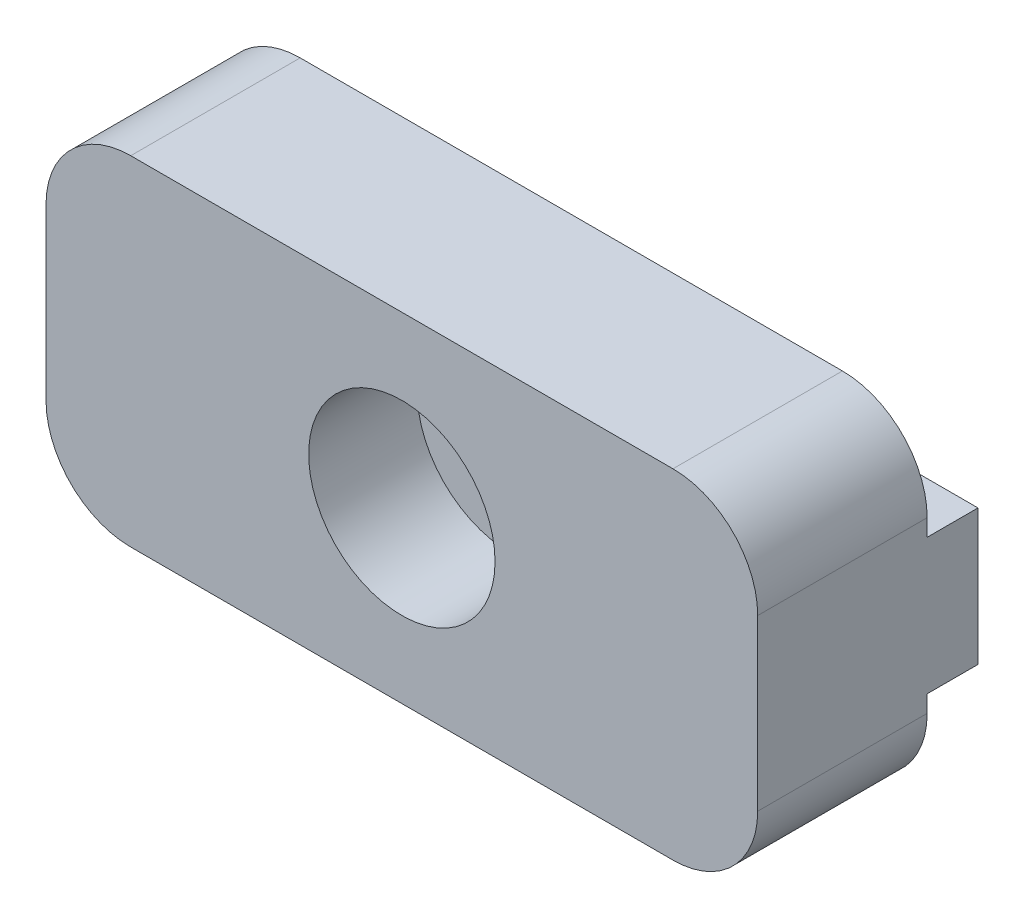
ISO-10303-21;
HEADER;
FILE_DESCRIPTION(('STEP AP214'),'2;1');
FILE_NAME('part.step','',(''),(''),'','','');
FILE_SCHEMA(('AUTOMOTIVE_DESIGN { 1 0 10303 214 1 1 1 1 }'));
ENDSEC;
DATA;
#1=APPLICATION_CONTEXT('core data for automotive mechanical design processes');
#2=APPLICATION_PROTOCOL_DEFINITION('international standard','automotive_design',2000,#1);
#3=PRODUCT_CONTEXT('',#1,'mechanical');
#4=PRODUCT('Part','Part','',(#3));
#5=PRODUCT_RELATED_PRODUCT_CATEGORY('part','',(#4));
#6=PRODUCT_DEFINITION_FORMATION('','',#4);
#7=PRODUCT_DEFINITION_CONTEXT('part definition',#1,'design');
#8=PRODUCT_DEFINITION('design','',#6,#7);
#9=PRODUCT_DEFINITION_SHAPE('','',#8);
#10=(LENGTH_UNIT() NAMED_UNIT(*) SI_UNIT(.MILLI.,.METRE.));
#11=(NAMED_UNIT(*) PLANE_ANGLE_UNIT() SI_UNIT($,.RADIAN.));
#12=(NAMED_UNIT(*) SI_UNIT($,.STERADIAN.) SOLID_ANGLE_UNIT());
#13=UNCERTAINTY_MEASURE_WITH_UNIT(LENGTH_MEASURE(1.E-05),#10,'distance_accuracy_value','');
#14=(GEOMETRIC_REPRESENTATION_CONTEXT(3) GLOBAL_UNCERTAINTY_ASSIGNED_CONTEXT((#13)) GLOBAL_UNIT_ASSIGNED_CONTEXT((#10,
#11,#12)) REPRESENTATION_CONTEXT('',''));
#15=CARTESIAN_POINT('',(0.,0.,0.));
#16=DIRECTION('',(0.,0.,1.));
#17=DIRECTION('',(1.,0.,0.));
#18=AXIS2_PLACEMENT_3D('',#15,#16,#17);
#19=CARTESIAN_POINT('',(0.,0.,0.));
#20=DIRECTION('',(0.,0.,1.));
#21=DIRECTION('',(1.,0.,0.));
#22=AXIS2_PLACEMENT_3D('',#19,#20,#21);
#23=PLANE('',#22);
#24=CARTESIAN_POINT('',(0.,0.,0.));
#25=DIRECTION('',(0.,0.,1.));
#26=DIRECTION('',(1.,0.,0.));
#27=AXIS2_PLACEMENT_3D('',#24,#25,#26);
#28=CIRCLE('',#27,3.3);
#29=CARTESIAN_POINT('',(3.3,0.,0.));
#30=VERTEX_POINT('',#29);
#31=EDGE_CURVE('E228',#30,#30,#28,.T.);
#32=ORIENTED_EDGE('',*,*,#31,.T.);
#33=EDGE_LOOP('',(#32));
#34=FACE_BOUND('',#33,.T.);
#35=DIRECTION('',(0.,-1.,0.));
#36=VECTOR('',#35,1.);
#37=CARTESIAN_POINT('',(-21.,10.,0.));
#38=LINE('',#37,#36);
#39=CARTESIAN_POINT('',(-21.,5.,0.));
#40=VERTEX_POINT('',#39);
#41=CARTESIAN_POINT('',(-21.,4.,0.));
#42=VERTEX_POINT('',#41);
#43=EDGE_CURVE('E250',#40,#42,#38,.T.);
#44=ORIENTED_EDGE('',*,*,#43,.F.);
#45=CARTESIAN_POINT('',(-16.,5.,0.));
#46=DIRECTION('',(0.,0.,1.));
#47=DIRECTION('',(1.,0.,0.));
#48=AXIS2_PLACEMENT_3D('',#45,#46,#47);
#49=CIRCLE('',#48,5.);
#50=CARTESIAN_POINT('',(-16.,10.,0.));
#51=VERTEX_POINT('',#50);
#52=EDGE_CURVE('E263',#40,#51,#49,.F.);
#53=ORIENTED_EDGE('',*,*,#52,.T.);
#54=DIRECTION('',(-1.,0.,0.));
#55=VECTOR('',#54,1.);
#56=CARTESIAN_POINT('',(-21.,10.,0.));
#57=LINE('',#56,#55);
#58=CARTESIAN_POINT('',(16.,10.,0.));
#59=VERTEX_POINT('',#58);
#60=EDGE_CURVE('E246',#59,#51,#57,.T.);
#61=ORIENTED_EDGE('',*,*,#60,.F.);
#62=CARTESIAN_POINT('',(16.,5.,0.));
#63=DIRECTION('',(0.,0.,1.));
#64=DIRECTION('',(1.,0.,0.));
#65=AXIS2_PLACEMENT_3D('',#62,#63,#64);
#66=CIRCLE('',#65,5.);
#67=CARTESIAN_POINT('',(21.,5.,0.));
#68=VERTEX_POINT('',#67);
#69=EDGE_CURVE('E259',#59,#68,#66,.F.);
#70=ORIENTED_EDGE('',*,*,#69,.T.);
#71=DIRECTION('',(0.,1.,0.));
#72=VECTOR('',#71,1.);
#73=CARTESIAN_POINT('',(21.,10.,0.));
#74=LINE('',#73,#72);
#75=CARTESIAN_POINT('',(21.,4.,0.));
#76=VERTEX_POINT('',#75);
#77=EDGE_CURVE('E231',#76,#68,#74,.T.);
#78=ORIENTED_EDGE('',*,*,#77,.F.);
#79=DIRECTION('',(-1.,0.,0.));
#80=VECTOR('',#79,1.);
#81=CARTESIAN_POINT('',(0.,4.,0.));
#82=LINE('',#81,#80);
#83=CARTESIAN_POINT('',(8.06225774829855,4.,0.));
#84=VERTEX_POINT('',#83);
#85=EDGE_CURVE('E205',#76,#84,#82,.T.);
#86=ORIENTED_EDGE('',*,*,#85,.T.);
#87=CARTESIAN_POINT('',(0.,0.,0.));
#88=DIRECTION('',(0.,0.,-1.));
#89=DIRECTION('',(-1.,0.,0.));
#90=AXIS2_PLACEMENT_3D('',#87,#88,#89);
#91=CIRCLE('',#90,9.);
#92=CARTESIAN_POINT('',(8.06225774829855,-4.,0.));
#93=VERTEX_POINT('',#92);
#94=EDGE_CURVE('E162',#84,#93,#91,.T.);
#95=ORIENTED_EDGE('',*,*,#94,.T.);
#96=DIRECTION('',(-1.,0.,0.));
#97=VECTOR('',#96,1.);
#98=CARTESIAN_POINT('',(0.,-4.,0.));
#99=LINE('',#98,#97);
#100=CARTESIAN_POINT('',(21.,-4.,0.));
#101=VERTEX_POINT('',#100);
#102=EDGE_CURVE('E195',#101,#93,#99,.T.);
#103=ORIENTED_EDGE('',*,*,#102,.F.);
#104=CARTESIAN_POINT('',(21.,-5.,0.));
#105=VERTEX_POINT('',#104);
#106=EDGE_CURVE('E244',#105,#101,#74,.T.);
#107=ORIENTED_EDGE('',*,*,#106,.F.);
#108=CARTESIAN_POINT('',(16.,-5.,0.));
#109=DIRECTION('',(0.,0.,1.));
#110=DIRECTION('',(1.,0.,0.));
#111=AXIS2_PLACEMENT_3D('',#108,#109,#110);
#112=CIRCLE('',#111,5.);
#113=CARTESIAN_POINT('',(16.,-10.,0.));
#114=VERTEX_POINT('',#113);
#115=EDGE_CURVE('E257',#105,#114,#112,.F.);
#116=ORIENTED_EDGE('',*,*,#115,.T.);
#117=DIRECTION('',(1.,0.,0.));
#118=VECTOR('',#117,1.);
#119=CARTESIAN_POINT('',(-21.,-10.,0.));
#120=LINE('',#119,#118);
#121=CARTESIAN_POINT('',(-16.,-10.,0.));
#122=VERTEX_POINT('',#121);
#123=EDGE_CURVE('E236',#122,#114,#120,.T.);
#124=ORIENTED_EDGE('',*,*,#123,.F.);
#125=CARTESIAN_POINT('',(-16.,-5.,0.));
#126=DIRECTION('',(0.,0.,1.));
#127=DIRECTION('',(1.,0.,0.));
#128=AXIS2_PLACEMENT_3D('',#125,#126,#127);
#129=CIRCLE('',#128,5.);
#130=CARTESIAN_POINT('',(-21.,-5.,0.));
#131=VERTEX_POINT('',#130);
#132=EDGE_CURVE('E261',#122,#131,#129,.F.);
#133=ORIENTED_EDGE('',*,*,#132,.T.);
#134=CARTESIAN_POINT('',(-21.,-4.,0.));
#135=VERTEX_POINT('',#134);
#136=EDGE_CURVE('E249',#135,#131,#38,.T.);
#137=ORIENTED_EDGE('',*,*,#136,.F.);
#138=DIRECTION('',(-1.,0.,0.));
#139=VECTOR('',#138,1.);
#140=CARTESIAN_POINT('',(0.,-4.,0.));
#141=LINE('',#140,#139);
#142=CARTESIAN_POINT('',(-8.06225774829855,-4.,0.));
#143=VERTEX_POINT('',#142);
#144=EDGE_CURVE('E178',#143,#135,#141,.T.);
#145=ORIENTED_EDGE('',*,*,#144,.F.);
#146=CARTESIAN_POINT('',(0.,0.,0.));
#147=DIRECTION('',(0.,0.,-1.));
#148=DIRECTION('',(-1.,0.,0.));
#149=AXIS2_PLACEMENT_3D('',#146,#147,#148);
#150=CIRCLE('',#149,9.);
#151=CARTESIAN_POINT('',(-8.06225774829855,4.,0.));
#152=VERTEX_POINT('',#151);
#153=EDGE_CURVE('E158',#143,#152,#150,.T.);
#154=ORIENTED_EDGE('',*,*,#153,.T.);
#155=DIRECTION('',(-1.,0.,0.));
#156=VECTOR('',#155,1.);
#157=CARTESIAN_POINT('',(0.,4.,0.));
#158=LINE('',#157,#156);
#159=EDGE_CURVE('E175',#152,#42,#158,.T.);
#160=ORIENTED_EDGE('',*,*,#159,.T.);
#161=EDGE_LOOP('',(#44,#53,#61,#70,#78,#86,#95,#103,#107,#116,#124,#133,#137,#145,#154,#160));
#162=FACE_BOUND('',#161,.T.);
#163=ADVANCED_FACE('F37',(#34,#162),#23,.F.);
#164=CARTESIAN_POINT('',(21.,10.,10.));
#165=DIRECTION('',(-1.,0.,0.));
#166=DIRECTION('',(0.,-1.,0.));
#167=AXIS2_PLACEMENT_3D('',#164,#165,#166);
#168=PLANE('',#167);
#169=ORIENTED_EDGE('',*,*,#77,.T.);
#170=DIRECTION('',(0.,0.,-1.));
#171=VECTOR('',#170,1.);
#172=CARTESIAN_POINT('',(21.,5.,10.));
#173=LINE('',#172,#171);
#174=CARTESIAN_POINT('',(21.,5.,10.));
#175=VERTEX_POINT('',#174);
#176=EDGE_CURVE('E11',#68,#175,#173,.F.);
#177=ORIENTED_EDGE('',*,*,#176,.T.);
#178=DIRECTION('',(0.,1.,0.));
#179=VECTOR('',#178,1.);
#180=CARTESIAN_POINT('',(21.,10.,10.));
#181=LINE('',#180,#179);
#182=CARTESIAN_POINT('',(21.,-5.,10.));
#183=VERTEX_POINT('',#182);
#184=EDGE_CURVE('E232',#183,#175,#181,.T.);
#185=ORIENTED_EDGE('',*,*,#184,.F.);
#186=DIRECTION('',(0.,0.,-1.));
#187=VECTOR('',#186,1.);
#188=CARTESIAN_POINT('',(21.,-5.,10.));
#189=LINE('',#188,#187);
#190=EDGE_CURVE('E45',#183,#105,#189,.T.);
#191=ORIENTED_EDGE('',*,*,#190,.T.);
#192=ORIENTED_EDGE('',*,*,#106,.T.);
#193=DIRECTION('',(0.,0.,1.));
#194=VECTOR('',#193,1.);
#195=CARTESIAN_POINT('',(21.,-4.,-3.));
#196=LINE('',#195,#194);
#197=CARTESIAN_POINT('',(21.,-4.,-3.));
#198=VERTEX_POINT('',#197);
#199=EDGE_CURVE('E211',#198,#101,#196,.T.);
#200=ORIENTED_EDGE('',*,*,#199,.F.);
#201=DIRECTION('',(0.,-1.,0.));
#202=VECTOR('',#201,1.);
#203=CARTESIAN_POINT('',(21.,0.,-3.));
#204=LINE('',#203,#202);
#205=CARTESIAN_POINT('',(21.,4.,-3.));
#206=VERTEX_POINT('',#205);
#207=EDGE_CURVE('E198',#206,#198,#204,.T.);
#208=ORIENTED_EDGE('',*,*,#207,.F.);
#209=DIRECTION('',(0.,0.,1.));
#210=VECTOR('',#209,1.);
#211=CARTESIAN_POINT('',(21.,4.,-3.));
#212=LINE('',#211,#210);
#213=EDGE_CURVE('E214',#206,#76,#212,.T.);
#214=ORIENTED_EDGE('',*,*,#213,.T.);
#215=EDGE_LOOP('',(#169,#177,#185,#191,#192,#200,#208,#214));
#216=FACE_BOUND('',#215,.T.);
#217=ADVANCED_FACE('F286',(#216),#168,.F.);
#218=CARTESIAN_POINT('',(-21.,10.,10.));
#219=DIRECTION('',(0.,-1.,0.));
#220=DIRECTION('',(0.,0.,-1.));
#221=AXIS2_PLACEMENT_3D('',#218,#219,#220);
#222=PLANE('',#221);
#223=ORIENTED_EDGE('',*,*,#60,.T.);
#224=DIRECTION('',(0.,0.,-1.));
#225=VECTOR('',#224,1.);
#226=CARTESIAN_POINT('',(-16.,10.,10.));
#227=LINE('',#226,#225);
#228=CARTESIAN_POINT('',(-16.,10.,10.));
#229=VERTEX_POINT('',#228);
#230=EDGE_CURVE('E268',#51,#229,#227,.F.);
#231=ORIENTED_EDGE('',*,*,#230,.T.);
#232=DIRECTION('',(-1.,0.,0.));
#233=VECTOR('',#232,1.);
#234=CARTESIAN_POINT('',(-21.,10.,10.));
#235=LINE('',#234,#233);
#236=CARTESIAN_POINT('',(16.,10.,10.));
#237=VERTEX_POINT('',#236);
#238=EDGE_CURVE('E235',#237,#229,#235,.T.);
#239=ORIENTED_EDGE('',*,*,#238,.F.);
#240=DIRECTION('',(0.,0.,-1.));
#241=VECTOR('',#240,1.);
#242=CARTESIAN_POINT('',(16.,10.,10.));
#243=LINE('',#242,#241);
#244=EDGE_CURVE('E265',#237,#59,#243,.T.);
#245=ORIENTED_EDGE('',*,*,#244,.T.);
#246=EDGE_LOOP('',(#223,#231,#239,#245));
#247=FACE_BOUND('',#246,.T.);
#248=ADVANCED_FACE('F317',(#247),#222,.F.);
#249=CARTESIAN_POINT('',(-21.,10.,10.));
#250=DIRECTION('',(1.,0.,0.));
#251=DIRECTION('',(0.,1.,0.));
#252=AXIS2_PLACEMENT_3D('',#249,#250,#251);
#253=PLANE('',#252);
#254=DIRECTION('',(0.,-1.,0.));
#255=VECTOR('',#254,1.);
#256=CARTESIAN_POINT('',(-21.,10.,10.));
#257=LINE('',#256,#255);
#258=CARTESIAN_POINT('',(-21.,5.,10.));
#259=VERTEX_POINT('',#258);
#260=CARTESIAN_POINT('',(-21.,-5.,10.));
#261=VERTEX_POINT('',#260);
#262=EDGE_CURVE('E239',#259,#261,#257,.T.);
#263=ORIENTED_EDGE('',*,*,#262,.F.);
#264=DIRECTION('',(0.,0.,-1.));
#265=VECTOR('',#264,1.);
#266=CARTESIAN_POINT('',(-21.,5.,10.));
#267=LINE('',#266,#265);
#268=EDGE_CURVE('E254',#259,#40,#267,.T.);
#269=ORIENTED_EDGE('',*,*,#268,.T.);
#270=ORIENTED_EDGE('',*,*,#43,.T.);
#271=DIRECTION('',(0.,0.,1.));
#272=VECTOR('',#271,1.);
#273=CARTESIAN_POINT('',(-21.,4.,-3.));
#274=LINE('',#273,#272);
#275=CARTESIAN_POINT('',(-21.,4.,-3.));
#276=VERTEX_POINT('',#275);
#277=EDGE_CURVE('E187',#276,#42,#274,.T.);
#278=ORIENTED_EDGE('',*,*,#277,.F.);
#279=DIRECTION('',(0.,1.,0.));
#280=VECTOR('',#279,1.);
#281=CARTESIAN_POINT('',(-21.,0.,-3.));
#282=LINE('',#281,#280);
#283=CARTESIAN_POINT('',(-21.,-4.,-3.));
#284=VERTEX_POINT('',#283);
#285=EDGE_CURVE('E170',#284,#276,#282,.T.);
#286=ORIENTED_EDGE('',*,*,#285,.F.);
#287=DIRECTION('',(0.,0.,1.));
#288=VECTOR('',#287,1.);
#289=CARTESIAN_POINT('',(-21.,-4.,-3.));
#290=LINE('',#289,#288);
#291=EDGE_CURVE('E163',#284,#135,#290,.T.);
#292=ORIENTED_EDGE('',*,*,#291,.T.);
#293=ORIENTED_EDGE('',*,*,#136,.T.);
#294=DIRECTION('',(0.,0.,-1.));
#295=VECTOR('',#294,1.);
#296=CARTESIAN_POINT('',(-21.,-5.,10.));
#297=LINE('',#296,#295);
#298=EDGE_CURVE('E243',#131,#261,#297,.F.);
#299=ORIENTED_EDGE('',*,*,#298,.T.);
#300=EDGE_LOOP('',(#263,#269,#270,#278,#286,#292,#293,#299));
#301=FACE_BOUND('',#300,.T.);
#302=ADVANCED_FACE('F324',(#301),#253,.F.);
#303=CARTESIAN_POINT('',(-21.,-10.,10.));
#304=DIRECTION('',(0.,1.,0.));
#305=DIRECTION('',(0.,0.,1.));
#306=AXIS2_PLACEMENT_3D('',#303,#304,#305);
#307=PLANE('',#306);
#308=DIRECTION('',(1.,0.,0.));
#309=VECTOR('',#308,1.);
#310=CARTESIAN_POINT('',(-21.,-10.,10.));
#311=LINE('',#310,#309);
#312=CARTESIAN_POINT('',(-16.,-10.,10.));
#313=VERTEX_POINT('',#312);
#314=CARTESIAN_POINT('',(16.,-10.,10.));
#315=VERTEX_POINT('',#314);
#316=EDGE_CURVE('E241',#313,#315,#311,.T.);
#317=ORIENTED_EDGE('',*,*,#316,.F.);
#318=DIRECTION('',(0.,0.,-1.));
#319=VECTOR('',#318,1.);
#320=CARTESIAN_POINT('',(-16.,-10.,10.));
#321=LINE('',#320,#319);
#322=EDGE_CURVE('E278',#313,#122,#321,.T.);
#323=ORIENTED_EDGE('',*,*,#322,.T.);
#324=ORIENTED_EDGE('',*,*,#123,.T.);
#325=DIRECTION('',(0.,0.,-1.));
#326=VECTOR('',#325,1.);
#327=CARTESIAN_POINT('',(16.,-10.,10.));
#328=LINE('',#327,#326);
#329=EDGE_CURVE('E52',#114,#315,#328,.F.);
#330=ORIENTED_EDGE('',*,*,#329,.T.);
#331=EDGE_LOOP('',(#317,#323,#324,#330));
#332=FACE_BOUND('',#331,.T.);
#333=ADVANCED_FACE('F331',(#332),#307,.F.);
#334=CARTESIAN_POINT('',(0.,0.,10.));
#335=DIRECTION('',(0.,0.,1.));
#336=DIRECTION('',(1.,0.,0.));
#337=AXIS2_PLACEMENT_3D('',#334,#335,#336);
#338=PLANE('',#337);
#339=CARTESIAN_POINT('',(0.,0.,10.));
#340=DIRECTION('',(0.,0.,1.));
#341=DIRECTION('',(1.,0.,0.));
#342=AXIS2_PLACEMENT_3D('',#339,#340,#341);
#343=CIRCLE('',#342,5.49999999999999);
#344=CARTESIAN_POINT('',(5.49999999999999,0.,10.));
#345=VERTEX_POINT('',#344);
#346=EDGE_CURVE('E219',#345,#345,#343,.T.);
#347=ORIENTED_EDGE('',*,*,#346,.F.);
#348=EDGE_LOOP('',(#347));
#349=FACE_BOUND('',#348,.T.);
#350=ORIENTED_EDGE('',*,*,#238,.T.);
#351=CARTESIAN_POINT('',(-16.,5.,10.));
#352=DIRECTION('',(0.,0.,1.));
#353=DIRECTION('',(1.,0.,0.));
#354=AXIS2_PLACEMENT_3D('',#351,#352,#353);
#355=CIRCLE('',#354,5.);
#356=EDGE_CURVE('E275',#229,#259,#355,.T.);
#357=ORIENTED_EDGE('',*,*,#356,.T.);
#358=ORIENTED_EDGE('',*,*,#262,.T.);
#359=CARTESIAN_POINT('',(-16.,-5.,10.));
#360=DIRECTION('',(0.,0.,1.));
#361=DIRECTION('',(1.,0.,0.));
#362=AXIS2_PLACEMENT_3D('',#359,#360,#361);
#363=CIRCLE('',#362,5.);
#364=EDGE_CURVE('E59',#261,#313,#363,.T.);
#365=ORIENTED_EDGE('',*,*,#364,.T.);
#366=ORIENTED_EDGE('',*,*,#316,.T.);
#367=CARTESIAN_POINT('',(16.,-5.,10.));
#368=DIRECTION('',(0.,0.,1.));
#369=DIRECTION('',(1.,0.,0.));
#370=AXIS2_PLACEMENT_3D('',#367,#368,#369);
#371=CIRCLE('',#370,5.);
#372=EDGE_CURVE('E270',#315,#183,#371,.T.);
#373=ORIENTED_EDGE('',*,*,#372,.T.);
#374=ORIENTED_EDGE('',*,*,#184,.T.);
#375=CARTESIAN_POINT('',(16.,5.,10.));
#376=DIRECTION('',(0.,0.,1.));
#377=DIRECTION('',(1.,0.,0.));
#378=AXIS2_PLACEMENT_3D('',#375,#376,#377);
#379=CIRCLE('',#378,5.);
#380=EDGE_CURVE('E272',#175,#237,#379,.T.);
#381=ORIENTED_EDGE('',*,*,#380,.T.);
#382=EDGE_LOOP('',(#350,#357,#358,#365,#366,#373,#374,#381));
#383=FACE_BOUND('',#382,.T.);
#384=ADVANCED_FACE('F314',(#349,#383),#338,.T.);
#385=CARTESIAN_POINT('',(0.,0.,10.));
#386=DIRECTION('',(0.,0.,1.));
#387=DIRECTION('',(1.,0.,0.));
#388=AXIS2_PLACEMENT_3D('',#385,#386,#387);
#389=CYLINDRICAL_SURFACE('',#388,3.3);
#390=ORIENTED_EDGE('',*,*,#31,.F.);
#391=EDGE_LOOP('',(#390));
#392=FACE_BOUND('',#391,.T.);
#393=CARTESIAN_POINT('',(0.,0.,3.6));
#394=DIRECTION('',(0.,0.,1.));
#395=DIRECTION('',(1.,0.,0.));
#396=AXIS2_PLACEMENT_3D('',#393,#394,#395);
#397=CIRCLE('',#396,3.30000000000001);
#398=CARTESIAN_POINT('',(3.30000000000001,0.,3.6));
#399=VERTEX_POINT('',#398);
#400=EDGE_CURVE('E225',#399,#399,#397,.T.);
#401=ORIENTED_EDGE('',*,*,#400,.T.);
#402=EDGE_LOOP('',(#401));
#403=FACE_BOUND('',#402,.T.);
#404=ADVANCED_FACE('F399',(#392,#403),#389,.F.);
#405=CARTESIAN_POINT('',(3.30000000000001,0.,3.6));
#406=DIRECTION('',(0.,0.,-1.));
#407=DIRECTION('',(-1.,0.,0.));
#408=AXIS2_PLACEMENT_3D('',#405,#406,#407);
#409=PLANE('',#408);
#410=ORIENTED_EDGE('',*,*,#400,.F.);
#411=EDGE_LOOP('',(#410));
#412=FACE_BOUND('',#411,.T.);
#413=CARTESIAN_POINT('',(0.,0.,3.6));
#414=DIRECTION('',(0.,0.,1.));
#415=DIRECTION('',(1.,0.,0.));
#416=AXIS2_PLACEMENT_3D('',#413,#414,#415);
#417=CIRCLE('',#416,5.49999999999999);
#418=CARTESIAN_POINT('',(5.49999999999999,0.,3.6));
#419=VERTEX_POINT('',#418);
#420=EDGE_CURVE('E222',#419,#419,#417,.T.);
#421=ORIENTED_EDGE('',*,*,#420,.T.);
#422=EDGE_LOOP('',(#421));
#423=FACE_BOUND('',#422,.T.);
#424=ADVANCED_FACE('F439',(#412,#423),#409,.F.);
#425=CARTESIAN_POINT('',(0.,0.,10.));
#426=DIRECTION('',(0.,0.,1.));
#427=DIRECTION('',(1.,0.,0.));
#428=AXIS2_PLACEMENT_3D('',#425,#426,#427);
#429=CYLINDRICAL_SURFACE('',#428,5.49999999999999);
#430=ORIENTED_EDGE('',*,*,#420,.F.);
#431=EDGE_LOOP('',(#430));
#432=FACE_BOUND('',#431,.T.);
#433=ORIENTED_EDGE('',*,*,#346,.T.);
#434=EDGE_LOOP('',(#433));
#435=FACE_BOUND('',#434,.T.);
#436=ADVANCED_FACE('F434',(#432,#435),#429,.F.);
#437=CARTESIAN_POINT('',(0.,0.,-3.));
#438=DIRECTION('',(0.,0.,1.));
#439=DIRECTION('',(1.,0.,0.));
#440=AXIS2_PLACEMENT_3D('',#437,#438,#439);
#441=CYLINDRICAL_SURFACE('',#440,9.);
#442=ORIENTED_EDGE('',*,*,#94,.F.);
#443=DIRECTION('',(0.,0.,1.));
#444=VECTOR('',#443,1.);
#445=CARTESIAN_POINT('',(8.06225774829855,4.,-3.));
#446=LINE('',#445,#444);
#447=CARTESIAN_POINT('',(8.06225774829855,4.,-3.));
#448=VERTEX_POINT('',#447);
#449=EDGE_CURVE('E216',#448,#84,#446,.T.);
#450=ORIENTED_EDGE('',*,*,#449,.F.);
#451=CARTESIAN_POINT('',(0.,0.,-3.));
#452=DIRECTION('',(0.,0.,-1.));
#453=DIRECTION('',(-1.,0.,0.));
#454=AXIS2_PLACEMENT_3D('',#451,#452,#453);
#455=CIRCLE('',#454,9.);
#456=CARTESIAN_POINT('',(8.06225774829855,-4.,-3.));
#457=VERTEX_POINT('',#456);
#458=EDGE_CURVE('E191',#448,#457,#455,.T.);
#459=ORIENTED_EDGE('',*,*,#458,.T.);
#460=DIRECTION('',(0.,0.,1.));
#461=VECTOR('',#460,1.);
#462=CARTESIAN_POINT('',(8.06225774829855,-4.,-3.));
#463=LINE('',#462,#461);
#464=EDGE_CURVE('E202',#457,#93,#463,.T.);
#465=ORIENTED_EDGE('',*,*,#464,.T.);
#466=EDGE_LOOP('',(#442,#450,#459,#465));
#467=FACE_BOUND('',#466,.T.);
#468=ADVANCED_FACE('F438',(#467),#441,.F.);
#469=CARTESIAN_POINT('',(0.,4.,-3.));
#470=DIRECTION('',(0.,1.,0.));
#471=DIRECTION('',(0.,0.,1.));
#472=AXIS2_PLACEMENT_3D('',#469,#470,#471);
#473=PLANE('',#472);
#474=ORIENTED_EDGE('',*,*,#85,.F.);
#475=ORIENTED_EDGE('',*,*,#213,.F.);
#476=DIRECTION('',(-1.,0.,0.));
#477=VECTOR('',#476,1.);
#478=CARTESIAN_POINT('',(0.,4.,-3.));
#479=LINE('',#478,#477);
#480=EDGE_CURVE('E194',#206,#448,#479,.T.);
#481=ORIENTED_EDGE('',*,*,#480,.T.);
#482=ORIENTED_EDGE('',*,*,#449,.T.);
#483=EDGE_LOOP('',(#474,#475,#481,#482));
#484=FACE_BOUND('',#483,.T.);
#485=ADVANCED_FACE('F305',(#484),#473,.T.);
#486=CARTESIAN_POINT('',(0.,-4.,-3.));
#487=DIRECTION('',(0.,1.,0.));
#488=DIRECTION('',(0.,0.,1.));
#489=AXIS2_PLACEMENT_3D('',#486,#487,#488);
#490=PLANE('',#489);
#491=ORIENTED_EDGE('',*,*,#102,.T.);
#492=ORIENTED_EDGE('',*,*,#464,.F.);
#493=DIRECTION('',(-1.,0.,0.));
#494=VECTOR('',#493,1.);
#495=CARTESIAN_POINT('',(0.,-4.,-3.));
#496=LINE('',#495,#494);
#497=EDGE_CURVE('E200',#198,#457,#496,.T.);
#498=ORIENTED_EDGE('',*,*,#497,.F.);
#499=ORIENTED_EDGE('',*,*,#199,.T.);
#500=EDGE_LOOP('',(#491,#492,#498,#499));
#501=FACE_BOUND('',#500,.T.);
#502=ADVANCED_FACE('F296',(#501),#490,.F.);
#503=CARTESIAN_POINT('',(0.,0.,-3.));
#504=DIRECTION('',(0.,0.,-1.));
#505=DIRECTION('',(-1.,0.,0.));
#506=AXIS2_PLACEMENT_3D('',#503,#504,#505);
#507=PLANE('',#506);
#508=ORIENTED_EDGE('',*,*,#458,.F.);
#509=ORIENTED_EDGE('',*,*,#480,.F.);
#510=ORIENTED_EDGE('',*,*,#207,.T.);
#511=ORIENTED_EDGE('',*,*,#497,.T.);
#512=EDGE_LOOP('',(#508,#509,#510,#511));
#513=FACE_BOUND('',#512,.T.);
#514=ADVANCED_FACE('F303',(#513),#507,.T.);
#515=CARTESIAN_POINT('',(0.,0.,-3.));
#516=DIRECTION('',(0.,0.,1.));
#517=DIRECTION('',(1.,0.,0.));
#518=AXIS2_PLACEMENT_3D('',#515,#516,#517);
#519=CYLINDRICAL_SURFACE('',#518,9.);
#520=ORIENTED_EDGE('',*,*,#153,.F.);
#521=DIRECTION('',(0.,0.,1.));
#522=VECTOR('',#521,1.);
#523=CARTESIAN_POINT('',(-8.06225774829855,-4.,-3.));
#524=LINE('',#523,#522);
#525=CARTESIAN_POINT('',(-8.06225774829855,-4.,-3.));
#526=VERTEX_POINT('',#525);
#527=EDGE_CURVE('E151',#526,#143,#524,.T.);
#528=ORIENTED_EDGE('',*,*,#527,.F.);
#529=CARTESIAN_POINT('',(0.,0.,-3.));
#530=DIRECTION('',(0.,0.,-1.));
#531=DIRECTION('',(-1.,0.,0.));
#532=AXIS2_PLACEMENT_3D('',#529,#530,#531);
#533=CIRCLE('',#532,9.);
#534=CARTESIAN_POINT('',(-8.06225774829855,4.,-3.));
#535=VERTEX_POINT('',#534);
#536=EDGE_CURVE('E155',#526,#535,#533,.T.);
#537=ORIENTED_EDGE('',*,*,#536,.T.);
#538=DIRECTION('',(0.,0.,1.));
#539=VECTOR('',#538,1.);
#540=CARTESIAN_POINT('',(-8.06225774829855,4.,-3.));
#541=LINE('',#540,#539);
#542=EDGE_CURVE('E183',#535,#152,#541,.T.);
#543=ORIENTED_EDGE('',*,*,#542,.T.);
#544=EDGE_LOOP('',(#520,#528,#537,#543));
#545=FACE_BOUND('',#544,.T.);
#546=ADVANCED_FACE('F153',(#545),#519,.F.);
#547=CARTESIAN_POINT('',(0.,-4.,-3.));
#548=DIRECTION('',(0.,1.,0.));
#549=DIRECTION('',(0.,0.,1.));
#550=AXIS2_PLACEMENT_3D('',#547,#548,#549);
#551=PLANE('',#550);
#552=ORIENTED_EDGE('',*,*,#144,.T.);
#553=ORIENTED_EDGE('',*,*,#291,.F.);
#554=DIRECTION('',(-1.,0.,0.));
#555=VECTOR('',#554,1.);
#556=CARTESIAN_POINT('',(0.,-4.,-3.));
#557=LINE('',#556,#555);
#558=EDGE_CURVE('E166',#526,#284,#557,.T.);
#559=ORIENTED_EDGE('',*,*,#558,.F.);
#560=ORIENTED_EDGE('',*,*,#527,.T.);
#561=EDGE_LOOP('',(#552,#553,#559,#560));
#562=FACE_BOUND('',#561,.T.);
#563=ADVANCED_FACE('F167',(#562),#551,.F.);
#564=CARTESIAN_POINT('',(0.,4.,-3.));
#565=DIRECTION('',(0.,1.,0.));
#566=DIRECTION('',(0.,0.,1.));
#567=AXIS2_PLACEMENT_3D('',#564,#565,#566);
#568=PLANE('',#567);
#569=ORIENTED_EDGE('',*,*,#159,.F.);
#570=ORIENTED_EDGE('',*,*,#542,.F.);
#571=DIRECTION('',(-1.,0.,0.));
#572=VECTOR('',#571,1.);
#573=CARTESIAN_POINT('',(0.,4.,-3.));
#574=LINE('',#573,#572);
#575=EDGE_CURVE('E174',#535,#276,#574,.T.);
#576=ORIENTED_EDGE('',*,*,#575,.T.);
#577=ORIENTED_EDGE('',*,*,#277,.T.);
#578=EDGE_LOOP('',(#569,#570,#576,#577));
#579=FACE_BOUND('',#578,.T.);
#580=ADVANCED_FACE('F334',(#579),#568,.T.);
#581=CARTESIAN_POINT('',(0.,0.,-3.));
#582=DIRECTION('',(0.,0.,-1.));
#583=DIRECTION('',(-1.,0.,0.));
#584=AXIS2_PLACEMENT_3D('',#581,#582,#583);
#585=PLANE('',#584);
#586=ORIENTED_EDGE('',*,*,#536,.F.);
#587=ORIENTED_EDGE('',*,*,#558,.T.);
#588=ORIENTED_EDGE('',*,*,#285,.T.);
#589=ORIENTED_EDGE('',*,*,#575,.F.);
#590=EDGE_LOOP('',(#586,#587,#588,#589));
#591=FACE_BOUND('',#590,.T.);
#592=ADVANCED_FACE('F172',(#591),#585,.T.);
#593=CARTESIAN_POINT('',(-16.,5.,10.));
#594=DIRECTION('',(0.,0.,-1.));
#595=DIRECTION('',(-1.,0.,0.));
#596=AXIS2_PLACEMENT_3D('',#593,#594,#595);
#597=CYLINDRICAL_SURFACE('',#596,5.);
#598=ORIENTED_EDGE('',*,*,#356,.F.);
#599=ORIENTED_EDGE('',*,*,#230,.F.);
#600=ORIENTED_EDGE('',*,*,#52,.F.);
#601=ORIENTED_EDGE('',*,*,#268,.F.);
#602=EDGE_LOOP('',(#598,#599,#600,#601));
#603=FACE_BOUND('',#602,.T.);
#604=ADVANCED_FACE('F320',(#603),#597,.T.);
#605=CARTESIAN_POINT('',(-16.,-5.,10.));
#606=DIRECTION('',(0.,0.,-1.));
#607=DIRECTION('',(-1.,0.,0.));
#608=AXIS2_PLACEMENT_3D('',#605,#606,#607);
#609=CYLINDRICAL_SURFACE('',#608,5.);
#610=ORIENTED_EDGE('',*,*,#364,.F.);
#611=ORIENTED_EDGE('',*,*,#298,.F.);
#612=ORIENTED_EDGE('',*,*,#132,.F.);
#613=ORIENTED_EDGE('',*,*,#322,.F.);
#614=EDGE_LOOP('',(#610,#611,#612,#613));
#615=FACE_BOUND('',#614,.T.);
#616=ADVANCED_FACE('F329',(#615),#609,.T.);
#617=CARTESIAN_POINT('',(16.,5.,10.));
#618=DIRECTION('',(0.,0.,-1.));
#619=DIRECTION('',(-1.,0.,0.));
#620=AXIS2_PLACEMENT_3D('',#617,#618,#619);
#621=CYLINDRICAL_SURFACE('',#620,5.);
#622=ORIENTED_EDGE('',*,*,#380,.F.);
#623=ORIENTED_EDGE('',*,*,#176,.F.);
#624=ORIENTED_EDGE('',*,*,#69,.F.);
#625=ORIENTED_EDGE('',*,*,#244,.F.);
#626=EDGE_LOOP('',(#622,#623,#624,#625));
#627=FACE_BOUND('',#626,.T.);
#628=ADVANCED_FACE('F311',(#627),#621,.T.);
#629=CARTESIAN_POINT('',(16.,-5.,10.));
#630=DIRECTION('',(0.,0.,-1.));
#631=DIRECTION('',(-1.,0.,0.));
#632=AXIS2_PLACEMENT_3D('',#629,#630,#631);
#633=CYLINDRICAL_SURFACE('',#632,5.);
#634=ORIENTED_EDGE('',*,*,#372,.F.);
#635=ORIENTED_EDGE('',*,*,#329,.F.);
#636=ORIENTED_EDGE('',*,*,#115,.F.);
#637=ORIENTED_EDGE('',*,*,#190,.F.);
#638=EDGE_LOOP('',(#634,#635,#636,#637));
#639=FACE_BOUND('',#638,.T.);
#640=ADVANCED_FACE('F39',(#639),#633,.T.);
#641=CLOSED_SHELL('',(#163,#217,#248,#302,#333,#384,#404,#424,#436,#468,#485,#502,#514,#546,
#563,#580,#592,#604,#616,#628,#640));
#642=MANIFOLD_SOLID_BREP('B2',#641);
#643=ADVANCED_BREP_SHAPE_REPRESENTATION('',(#18,#642),#14);
#644=SHAPE_DEFINITION_REPRESENTATION(#9,#643);
ENDSEC;
END-ISO-10303-21;
